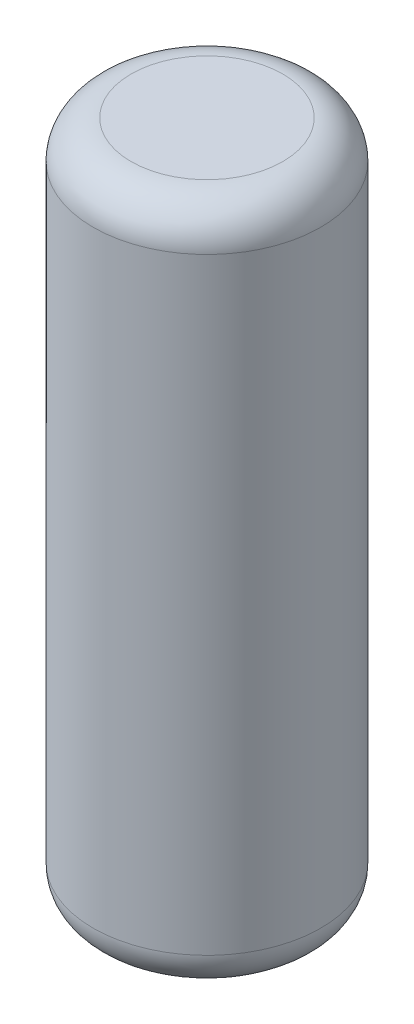
ISO-10303-21;
HEADER;
FILE_DESCRIPTION(('STEP AP214'),'2;1');
FILE_NAME('part.step','',(''),(''),'','','');
FILE_SCHEMA(('AUTOMOTIVE_DESIGN { 1 0 10303 214 1 1 1 1 }'));
ENDSEC;
DATA;
#1=APPLICATION_CONTEXT('core data for automotive mechanical design processes');
#2=APPLICATION_PROTOCOL_DEFINITION('international standard','automotive_design',2000,#1);
#3=PRODUCT_CONTEXT('',#1,'mechanical');
#4=PRODUCT('Part','Part','',(#3));
#5=PRODUCT_RELATED_PRODUCT_CATEGORY('part','',(#4));
#6=PRODUCT_DEFINITION_FORMATION('','',#4);
#7=PRODUCT_DEFINITION_CONTEXT('part definition',#1,'design');
#8=PRODUCT_DEFINITION('design','',#6,#7);
#9=PRODUCT_DEFINITION_SHAPE('','',#8);
#10=(LENGTH_UNIT() NAMED_UNIT(*) SI_UNIT(.MILLI.,.METRE.));
#11=(NAMED_UNIT(*) PLANE_ANGLE_UNIT() SI_UNIT($,.RADIAN.));
#12=(NAMED_UNIT(*) SI_UNIT($,.STERADIAN.) SOLID_ANGLE_UNIT());
#13=UNCERTAINTY_MEASURE_WITH_UNIT(LENGTH_MEASURE(1.E-05),#10,'distance_accuracy_value','');
#14=(GEOMETRIC_REPRESENTATION_CONTEXT(3) GLOBAL_UNCERTAINTY_ASSIGNED_CONTEXT((#13)) GLOBAL_UNIT_ASSIGNED_CONTEXT((#10,
#11,#12)) REPRESENTATION_CONTEXT('',''));
#15=CARTESIAN_POINT('',(0.,0.,0.));
#16=DIRECTION('',(0.,0.,1.));
#17=DIRECTION('',(1.,0.,0.));
#18=AXIS2_PLACEMENT_3D('',#15,#16,#17);
#19=CARTESIAN_POINT('',(544.883152388512,-857.807003363955,-990.480431195112));
#20=DIRECTION('',(0.,1.,0.));
#21=DIRECTION('',(0.,0.,1.));
#22=AXIS2_PLACEMENT_3D('',#19,#20,#21);
#23=PLANE('',#22);
#24=CARTESIAN_POINT('',(541.760652388512,-857.807003363955,-990.480431195112));
#25=DIRECTION('',(0.,-1.,0.));
#26=DIRECTION('',(0.,0.,-1.));
#27=AXIS2_PLACEMENT_3D('',#24,#25,#26);
#28=CIRCLE('',#27,1.);
#29=CARTESIAN_POINT('',(541.760652388512,-857.807003363955,-991.480431195112));
#30=VERTEX_POINT('',#29);
#31=CARTESIAN_POINT('',(541.760652388512,-857.807003363955,-989.480431195112));
#32=VERTEX_POINT('',#31);
#33=EDGE_CURVE('E48',#30,#32,#28,.T.);
#34=ORIENTED_EDGE('',*,*,#33,.F.);
#35=CARTESIAN_POINT('',(541.760652388512,-857.807003363955,-990.480431195112));
#36=DIRECTION('',(0.,-1.,0.));
#37=DIRECTION('',(1.11022302462516E-13,0.,1.));
#38=AXIS2_PLACEMENT_3D('',#35,#36,#37);
#39=CIRCLE('',#38,1.);
#40=EDGE_CURVE('E51',#32,#30,#39,.T.);
#41=ORIENTED_EDGE('',*,*,#40,.F.);
#42=EDGE_LOOP('',(#34,#41));
#43=FACE_BOUND('',#42,.T.);
#44=ADVANCED_FACE('F17',(#43),#23,.T.);
#45=CARTESIAN_POINT('',(544.883152388512,-866.807003363955,-990.480431195112));
#46=DIRECTION('',(0.,1.,0.));
#47=DIRECTION('',(0.,0.,1.));
#48=AXIS2_PLACEMENT_3D('',#45,#46,#47);
#49=PLANE('',#48);
#50=CARTESIAN_POINT('',(541.760652388512,-866.807003363955,-990.480431195112));
#51=DIRECTION('',(0.,1.,0.));
#52=DIRECTION('',(0.,0.,-1.));
#53=AXIS2_PLACEMENT_3D('',#50,#51,#52);
#54=CIRCLE('',#53,1.);
#55=CARTESIAN_POINT('',(541.760652388512,-866.807003363955,-991.480431195112));
#56=VERTEX_POINT('',#55);
#57=CARTESIAN_POINT('',(541.760652388512,-866.807003363955,-989.480431195112));
#58=VERTEX_POINT('',#57);
#59=EDGE_CURVE('E35',#56,#58,#54,.T.);
#60=ORIENTED_EDGE('',*,*,#59,.F.);
#61=CARTESIAN_POINT('',(541.760652388512,-866.807003363955,-990.480431195112));
#62=DIRECTION('',(0.,1.,0.));
#63=DIRECTION('',(1.11022302462528E-13,0.,1.));
#64=AXIS2_PLACEMENT_3D('',#61,#62,#63);
#65=CIRCLE('',#64,0.99999999999989);
#66=EDGE_CURVE('E39',#58,#56,#65,.T.);
#67=ORIENTED_EDGE('',*,*,#66,.F.);
#68=EDGE_LOOP('',(#60,#67));
#69=FACE_BOUND('',#68,.T.);
#70=ADVANCED_FACE('F86',(#69),#49,.F.);
#71=CARTESIAN_POINT('',(541.760652388512,-858.307003363955,-990.480431195112));
#72=DIRECTION('',(0.,1.,0.));
#73=DIRECTION('',(0.,0.,-1.));
#74=AXIS2_PLACEMENT_3D('',#71,#72,#73);
#75=TOROIDAL_SURFACE('',#74,1.,0.5);
#76=CARTESIAN_POINT('',(541.760652388512,-858.307003363955,-990.480431195112));
#77=DIRECTION('',(0.,1.,0.));
#78=DIRECTION('',(0.,0.,1.));
#79=AXIS2_PLACEMENT_3D('',#76,#77,#78);
#80=CIRCLE('',#79,1.5);
#81=CARTESIAN_POINT('',(541.760652388512,-858.307003363955,-988.980431195112));
#82=VERTEX_POINT('',#81);
#83=EDGE_CURVE('E28',#82,#82,#80,.F.);
#84=ORIENTED_EDGE('',*,*,#83,.F.);
#85=EDGE_LOOP('',(#84));
#86=FACE_BOUND('',#85,.T.);
#87=ORIENTED_EDGE('',*,*,#33,.T.);
#88=ORIENTED_EDGE('',*,*,#40,.T.);
#89=EDGE_LOOP('',(#87,#88));
#90=FACE_BOUND('',#89,.T.);
#91=ADVANCED_FACE('F57',(#86,#90),#75,.T.);
#92=CARTESIAN_POINT('',(541.760652388512,-866.307003363955,-990.480431195112));
#93=DIRECTION('',(0.,1.,0.));
#94=DIRECTION('',(0.,0.,-1.));
#95=AXIS2_PLACEMENT_3D('',#92,#93,#94);
#96=TOROIDAL_SURFACE('',#95,1.,0.5);
#97=CARTESIAN_POINT('',(541.760652388512,-866.307003363955,-990.480431195112));
#98=DIRECTION('',(0.,1.,0.));
#99=DIRECTION('',(0.,0.,1.));
#100=AXIS2_PLACEMENT_3D('',#97,#98,#99);
#101=CIRCLE('',#100,1.5);
#102=CARTESIAN_POINT('',(541.760652388512,-866.307003363955,-988.980431195112));
#103=VERTEX_POINT('',#102);
#104=EDGE_CURVE('E11',#103,#103,#101,.T.);
#105=ORIENTED_EDGE('',*,*,#104,.F.);
#106=EDGE_LOOP('',(#105));
#107=FACE_BOUND('',#106,.T.);
#108=ORIENTED_EDGE('',*,*,#66,.T.);
#109=ORIENTED_EDGE('',*,*,#59,.T.);
#110=EDGE_LOOP('',(#108,#109));
#111=FACE_BOUND('',#110,.T.);
#112=ADVANCED_FACE('F64',(#107,#111),#96,.T.);
#113=CARTESIAN_POINT('',(541.760652388512,-857.807003363955,-990.480431195112));
#114=DIRECTION('',(0.,1.,0.));
#115=DIRECTION('',(0.,0.,1.));
#116=AXIS2_PLACEMENT_3D('',#113,#114,#115);
#117=CYLINDRICAL_SURFACE('',#116,1.5);
#118=ORIENTED_EDGE('',*,*,#104,.T.);
#119=EDGE_LOOP('',(#118));
#120=FACE_BOUND('',#119,.T.);
#121=ORIENTED_EDGE('',*,*,#83,.T.);
#122=EDGE_LOOP('',(#121));
#123=FACE_BOUND('',#122,.T.);
#124=ADVANCED_FACE('F74',(#120,#123),#117,.T.);
#125=CLOSED_SHELL('',(#44,#70,#91,#112,#124));
#126=MANIFOLD_SOLID_BREP('B1',#125);
#127=ADVANCED_BREP_SHAPE_REPRESENTATION('',(#18,#126),#14);
#128=SHAPE_DEFINITION_REPRESENTATION(#9,#127);
ENDSEC;
END-ISO-10303-21;
